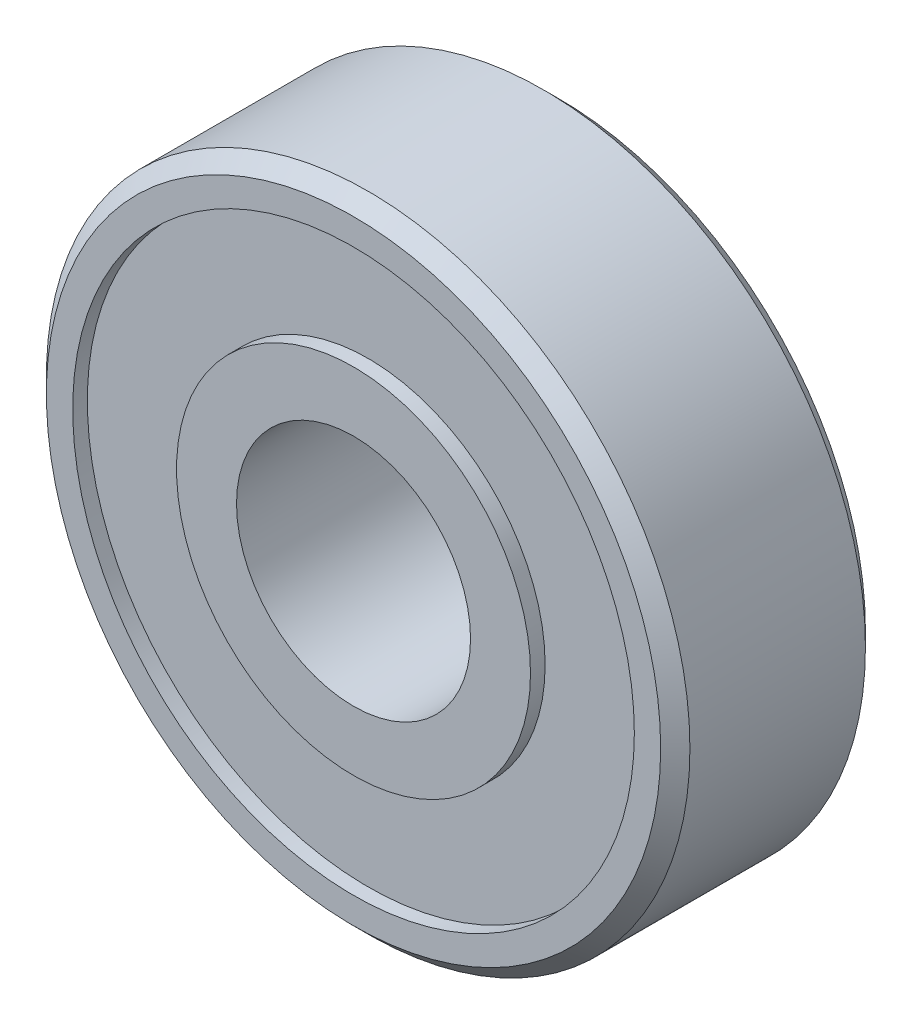
ISO-10303-21;
HEADER;
FILE_DESCRIPTION(('STEP AP214'),'2;1');
FILE_NAME('part.step','',(''),(''),'','','');
FILE_SCHEMA(('AUTOMOTIVE_DESIGN { 1 0 10303 214 1 1 1 1 }'));
ENDSEC;
DATA;
#1=APPLICATION_CONTEXT('core data for automotive mechanical design processes');
#2=APPLICATION_PROTOCOL_DEFINITION('international standard','automotive_design',2000,#1);
#3=PRODUCT_CONTEXT('',#1,'mechanical');
#4=PRODUCT('Part','Part','',(#3));
#5=PRODUCT_RELATED_PRODUCT_CATEGORY('part','',(#4));
#6=PRODUCT_DEFINITION_FORMATION('','',#4);
#7=PRODUCT_DEFINITION_CONTEXT('part definition',#1,'design');
#8=PRODUCT_DEFINITION('design','',#6,#7);
#9=PRODUCT_DEFINITION_SHAPE('','',#8);
#10=(LENGTH_UNIT() NAMED_UNIT(*) SI_UNIT(.MILLI.,.METRE.));
#11=(NAMED_UNIT(*) PLANE_ANGLE_UNIT() SI_UNIT($,.RADIAN.));
#12=(NAMED_UNIT(*) SI_UNIT($,.STERADIAN.) SOLID_ANGLE_UNIT());
#13=UNCERTAINTY_MEASURE_WITH_UNIT(LENGTH_MEASURE(1.E-05),#10,'distance_accuracy_value','');
#14=(GEOMETRIC_REPRESENTATION_CONTEXT(3) GLOBAL_UNCERTAINTY_ASSIGNED_CONTEXT((#13)) GLOBAL_UNIT_ASSIGNED_CONTEXT((#10,
#11,#12)) REPRESENTATION_CONTEXT('',''));
#15=CARTESIAN_POINT('',(0.,0.,0.));
#16=DIRECTION('',(0.,0.,1.));
#17=DIRECTION('',(1.,0.,0.));
#18=AXIS2_PLACEMENT_3D('',#15,#16,#17);
#19=CARTESIAN_POINT('',(0.,0.,-3.5));
#20=DIRECTION('',(0.,0.,1.));
#21=DIRECTION('',(1.,0.,0.));
#22=AXIS2_PLACEMENT_3D('',#19,#20,#21);
#23=PLANE('',#22);
#24=CARTESIAN_POINT('',(0.,0.,-3.5));
#25=DIRECTION('',(0.,0.,1.));
#26=DIRECTION('',(1.,0.,0.));
#27=AXIS2_PLACEMENT_3D('',#24,#25,#26);
#28=CIRCLE('',#27,4.);
#29=CARTESIAN_POINT('',(4.,0.,-3.5));
#30=VERTEX_POINT('',#29);
#31=EDGE_CURVE('E53',#30,#30,#28,.T.);
#32=ORIENTED_EDGE('',*,*,#31,.T.);
#33=EDGE_LOOP('',(#32));
#34=FACE_BOUND('',#33,.T.);
#35=CARTESIAN_POINT('',(0.,0.,-3.5));
#36=DIRECTION('',(0.,0.,1.));
#37=DIRECTION('',(1.,0.,0.));
#38=AXIS2_PLACEMENT_3D('',#35,#36,#37);
#39=CIRCLE('',#38,6.05);
#40=CARTESIAN_POINT('',(6.05,0.,-3.5));
#41=VERTEX_POINT('',#40);
#42=EDGE_CURVE('E75',#41,#41,#39,.T.);
#43=ORIENTED_EDGE('',*,*,#42,.F.);
#44=EDGE_LOOP('',(#43));
#45=FACE_BOUND('',#44,.T.);
#46=ADVANCED_FACE('F32',(#34,#45),#23,.F.);
#47=CARTESIAN_POINT('',(0.,0.,3.5));
#48=DIRECTION('',(0.,0.,1.));
#49=DIRECTION('',(1.,0.,0.));
#50=AXIS2_PLACEMENT_3D('',#47,#48,#49);
#51=PLANE('',#50);
#52=CARTESIAN_POINT('',(0.,0.,3.5));
#53=DIRECTION('',(0.,0.,1.));
#54=DIRECTION('',(1.,0.,0.));
#55=AXIS2_PLACEMENT_3D('',#52,#53,#54);
#56=CIRCLE('',#55,4.);
#57=CARTESIAN_POINT('',(4.,0.,3.5));
#58=VERTEX_POINT('',#57);
#59=EDGE_CURVE('E52',#58,#58,#56,.T.);
#60=ORIENTED_EDGE('',*,*,#59,.F.);
#61=EDGE_LOOP('',(#60));
#62=FACE_BOUND('',#61,.T.);
#63=CARTESIAN_POINT('',(0.,0.,3.5));
#64=DIRECTION('',(0.,0.,1.));
#65=DIRECTION('',(1.,0.,0.));
#66=AXIS2_PLACEMENT_3D('',#63,#64,#65);
#67=CIRCLE('',#66,6.05);
#68=CARTESIAN_POINT('',(6.05,0.,3.5));
#69=VERTEX_POINT('',#68);
#70=EDGE_CURVE('E63',#69,#69,#67,.T.);
#71=ORIENTED_EDGE('',*,*,#70,.T.);
#72=EDGE_LOOP('',(#71));
#73=FACE_BOUND('',#72,.T.);
#74=ADVANCED_FACE('F95',(#62,#73),#51,.T.);
#75=CARTESIAN_POINT('',(0.,0.,3.5));
#76=DIRECTION('',(0.,0.,1.));
#77=DIRECTION('',(1.,0.,0.));
#78=AXIS2_PLACEMENT_3D('',#75,#76,#77);
#79=CIRCLE('',#78,9.6);
#80=CARTESIAN_POINT('',(9.6,0.,3.5));
#81=VERTEX_POINT('',#80);
#82=EDGE_CURVE('E59',#81,#81,#79,.T.);
#83=ORIENTED_EDGE('',*,*,#82,.F.);
#84=EDGE_LOOP('',(#83));
#85=FACE_BOUND('',#84,.T.);
#86=CARTESIAN_POINT('',(0.,0.,3.5));
#87=DIRECTION('',(0.,0.,1.));
#88=DIRECTION('',(1.,0.,0.));
#89=AXIS2_PLACEMENT_3D('',#86,#87,#88);
#90=CIRCLE('',#89,10.5);
#91=CARTESIAN_POINT('',(10.5,0.,3.5));
#92=VERTEX_POINT('',#91);
#93=EDGE_CURVE('E10',#92,#92,#90,.T.);
#94=ORIENTED_EDGE('',*,*,#93,.T.);
#95=EDGE_LOOP('',(#94));
#96=FACE_BOUND('',#95,.T.);
#97=ADVANCED_FACE('F102',(#85,#96),#51,.T.);
#98=CARTESIAN_POINT('',(0.,0.,-3.5));
#99=DIRECTION('',(0.,0.,1.));
#100=DIRECTION('',(1.,0.,0.));
#101=AXIS2_PLACEMENT_3D('',#98,#99,#100);
#102=CIRCLE('',#101,9.6);
#103=CARTESIAN_POINT('',(9.6,0.,-3.5));
#104=VERTEX_POINT('',#103);
#105=EDGE_CURVE('E71',#104,#104,#102,.T.);
#106=ORIENTED_EDGE('',*,*,#105,.T.);
#107=EDGE_LOOP('',(#106));
#108=FACE_BOUND('',#107,.T.);
#109=CARTESIAN_POINT('',(0.,0.,-3.5));
#110=DIRECTION('',(0.,0.,1.));
#111=DIRECTION('',(1.,0.,0.));
#112=AXIS2_PLACEMENT_3D('',#109,#110,#111);
#113=CIRCLE('',#112,10.5);
#114=CARTESIAN_POINT('',(10.5,0.,-3.5));
#115=VERTEX_POINT('',#114);
#116=EDGE_CURVE('E39',#115,#115,#113,.F.);
#117=ORIENTED_EDGE('',*,*,#116,.T.);
#118=EDGE_LOOP('',(#117));
#119=FACE_BOUND('',#118,.T.);
#120=ADVANCED_FACE('F98',(#108,#119),#23,.F.);
#121=CARTESIAN_POINT('',(0.,0.,3.5));
#122=DIRECTION('',(0.,0.,-1.));
#123=DIRECTION('',(-1.,0.,0.));
#124=AXIS2_PLACEMENT_3D('',#121,#122,#123);
#125=CYLINDRICAL_SURFACE('',#124,11.);
#126=CARTESIAN_POINT('',(0.,0.,-3.));
#127=DIRECTION('',(0.,0.,1.));
#128=DIRECTION('',(1.,0.,0.));
#129=AXIS2_PLACEMENT_3D('',#126,#127,#128);
#130=CIRCLE('',#129,11.);
#131=CARTESIAN_POINT('',(11.,0.,-3.));
#132=VERTEX_POINT('',#131);
#133=EDGE_CURVE('E43',#132,#132,#130,.T.);
#134=ORIENTED_EDGE('',*,*,#133,.T.);
#135=EDGE_LOOP('',(#134));
#136=FACE_BOUND('',#135,.T.);
#137=CARTESIAN_POINT('',(0.,0.,3.00000000000001));
#138=DIRECTION('',(0.,0.,1.));
#139=DIRECTION('',(1.,0.,0.));
#140=AXIS2_PLACEMENT_3D('',#137,#138,#139);
#141=CIRCLE('',#140,11.);
#142=CARTESIAN_POINT('',(11.,0.,3.00000000000001));
#143=VERTEX_POINT('',#142);
#144=EDGE_CURVE('E47',#143,#143,#141,.F.);
#145=ORIENTED_EDGE('',*,*,#144,.T.);
#146=EDGE_LOOP('',(#145));
#147=FACE_BOUND('',#146,.T.);
#148=ADVANCED_FACE('F107',(#136,#147),#125,.T.);
#149=CARTESIAN_POINT('',(0.,0.,3.5));
#150=DIRECTION('',(0.,0.,-1.));
#151=DIRECTION('',(-1.,0.,0.));
#152=AXIS2_PLACEMENT_3D('',#149,#150,#151);
#153=CYLINDRICAL_SURFACE('',#152,4.);
#154=ORIENTED_EDGE('',*,*,#59,.T.);
#155=EDGE_LOOP('',(#154));
#156=FACE_BOUND('',#155,.T.);
#157=ORIENTED_EDGE('',*,*,#31,.F.);
#158=EDGE_LOOP('',(#157));
#159=FACE_BOUND('',#158,.T.);
#160=ADVANCED_FACE('F113',(#156,#159),#153,.F.);
#161=CARTESIAN_POINT('',(0.,0.,-3.));
#162=DIRECTION('',(0.,0.,1.));
#163=DIRECTION('',(1.,0.,0.));
#164=AXIS2_PLACEMENT_3D('',#161,#162,#163);
#165=CONICAL_SURFACE('',#164,11.,0.785398163397452);
#166=ORIENTED_EDGE('',*,*,#116,.F.);
#167=EDGE_LOOP('',(#166));
#168=FACE_BOUND('',#167,.T.);
#169=ORIENTED_EDGE('',*,*,#133,.F.);
#170=EDGE_LOOP('',(#169));
#171=FACE_BOUND('',#170,.T.);
#172=ADVANCED_FACE('F138',(#168,#171),#165,.T.);
#173=CARTESIAN_POINT('',(0.,0.,3.5));
#174=DIRECTION('',(0.,0.,-1.));
#175=DIRECTION('',(-1.,0.,0.));
#176=AXIS2_PLACEMENT_3D('',#173,#174,#175);
#177=CONICAL_SURFACE('',#176,10.5,0.785398163397448);
#178=ORIENTED_EDGE('',*,*,#144,.F.);
#179=EDGE_LOOP('',(#178));
#180=FACE_BOUND('',#179,.T.);
#181=ORIENTED_EDGE('',*,*,#93,.F.);
#182=EDGE_LOOP('',(#181));
#183=FACE_BOUND('',#182,.T.);
#184=ADVANCED_FACE('F34',(#180,#183),#177,.T.);
#185=CARTESIAN_POINT('',(0.,0.,3.));
#186=DIRECTION('',(0.,0.,1.));
#187=DIRECTION('',(1.,0.,0.));
#188=AXIS2_PLACEMENT_3D('',#185,#186,#187);
#189=CYLINDRICAL_SURFACE('',#188,6.05);
#190=CARTESIAN_POINT('',(0.,0.,3.));
#191=DIRECTION('',(0.,0.,1.));
#192=DIRECTION('',(1.,0.,0.));
#193=AXIS2_PLACEMENT_3D('',#190,#191,#192);
#194=CIRCLE('',#193,6.05);
#195=CARTESIAN_POINT('',(6.05,0.,3.));
#196=VERTEX_POINT('',#195);
#197=EDGE_CURVE('E62',#196,#196,#194,.T.);
#198=ORIENTED_EDGE('',*,*,#197,.T.);
#199=EDGE_LOOP('',(#198));
#200=FACE_BOUND('',#199,.T.);
#201=ORIENTED_EDGE('',*,*,#70,.F.);
#202=EDGE_LOOP('',(#201));
#203=FACE_BOUND('',#202,.T.);
#204=ADVANCED_FACE('F132',(#200,#203),#189,.T.);
#205=CARTESIAN_POINT('',(0.,0.,3.));
#206=DIRECTION('',(0.,0.,1.));
#207=DIRECTION('',(1.,0.,0.));
#208=AXIS2_PLACEMENT_3D('',#205,#206,#207);
#209=CYLINDRICAL_SURFACE('',#208,9.6);
#210=CARTESIAN_POINT('',(0.,0.,3.));
#211=DIRECTION('',(0.,0.,1.));
#212=DIRECTION('',(1.,0.,0.));
#213=AXIS2_PLACEMENT_3D('',#210,#211,#212);
#214=CIRCLE('',#213,9.6);
#215=CARTESIAN_POINT('',(9.6,0.,3.));
#216=VERTEX_POINT('',#215);
#217=EDGE_CURVE('E56',#216,#216,#214,.T.);
#218=ORIENTED_EDGE('',*,*,#217,.F.);
#219=EDGE_LOOP('',(#218));
#220=FACE_BOUND('',#219,.T.);
#221=ORIENTED_EDGE('',*,*,#82,.T.);
#222=EDGE_LOOP('',(#221));
#223=FACE_BOUND('',#222,.T.);
#224=ADVANCED_FACE('F128',(#220,#223),#209,.F.);
#225=CARTESIAN_POINT('',(0.,0.,3.));
#226=DIRECTION('',(0.,0.,1.));
#227=DIRECTION('',(1.,0.,0.));
#228=AXIS2_PLACEMENT_3D('',#225,#226,#227);
#229=PLANE('',#228);
#230=ORIENTED_EDGE('',*,*,#197,.F.);
#231=EDGE_LOOP('',(#230));
#232=FACE_BOUND('',#231,.T.);
#233=ORIENTED_EDGE('',*,*,#217,.T.);
#234=EDGE_LOOP('',(#233));
#235=FACE_BOUND('',#234,.T.);
#236=ADVANCED_FACE('F90',(#232,#235),#229,.T.);
#237=CARTESIAN_POINT('',(0.,0.,-3.));
#238=DIRECTION('',(0.,0.,-1.));
#239=DIRECTION('',(-1.,0.,0.));
#240=AXIS2_PLACEMENT_3D('',#237,#238,#239);
#241=CYLINDRICAL_SURFACE('',#240,6.05);
#242=CARTESIAN_POINT('',(0.,0.,-3.));
#243=DIRECTION('',(0.,0.,1.));
#244=DIRECTION('',(1.,0.,0.));
#245=AXIS2_PLACEMENT_3D('',#242,#243,#244);
#246=CIRCLE('',#245,6.05);
#247=CARTESIAN_POINT('',(6.05,0.,-3.));
#248=VERTEX_POINT('',#247);
#249=EDGE_CURVE('E74',#248,#248,#246,.T.);
#250=ORIENTED_EDGE('',*,*,#249,.F.);
#251=EDGE_LOOP('',(#250));
#252=FACE_BOUND('',#251,.T.);
#253=ORIENTED_EDGE('',*,*,#42,.T.);
#254=EDGE_LOOP('',(#253));
#255=FACE_BOUND('',#254,.T.);
#256=ADVANCED_FACE('F86',(#252,#255),#241,.T.);
#257=CARTESIAN_POINT('',(0.,0.,-3.));
#258=DIRECTION('',(0.,0.,-1.));
#259=DIRECTION('',(-1.,0.,0.));
#260=AXIS2_PLACEMENT_3D('',#257,#258,#259);
#261=CYLINDRICAL_SURFACE('',#260,9.6);
#262=CARTESIAN_POINT('',(0.,0.,-3.));
#263=DIRECTION('',(0.,0.,1.));
#264=DIRECTION('',(1.,0.,0.));
#265=AXIS2_PLACEMENT_3D('',#262,#263,#264);
#266=CIRCLE('',#265,9.6);
#267=CARTESIAN_POINT('',(9.6,0.,-3.));
#268=VERTEX_POINT('',#267);
#269=EDGE_CURVE('E66',#268,#268,#266,.T.);
#270=ORIENTED_EDGE('',*,*,#269,.T.);
#271=EDGE_LOOP('',(#270));
#272=FACE_BOUND('',#271,.T.);
#273=ORIENTED_EDGE('',*,*,#105,.F.);
#274=EDGE_LOOP('',(#273));
#275=FACE_BOUND('',#274,.T.);
#276=ADVANCED_FACE('F89',(#272,#275),#261,.F.);
#277=CARTESIAN_POINT('',(0.,0.,-3.));
#278=DIRECTION('',(0.,0.,-1.));
#279=DIRECTION('',(1.,0.,0.));
#280=AXIS2_PLACEMENT_3D('',#277,#278,#279);
#281=PLANE('',#280);
#282=ORIENTED_EDGE('',*,*,#249,.T.);
#283=EDGE_LOOP('',(#282));
#284=FACE_BOUND('',#283,.T.);
#285=ORIENTED_EDGE('',*,*,#269,.F.);
#286=EDGE_LOOP('',(#285));
#287=FACE_BOUND('',#286,.T.);
#288=ADVANCED_FACE('F83',(#284,#287),#281,.T.);
#289=CLOSED_SHELL('',(#46,#74,#97,#120,#148,#160,#172,#184,#204,#224,#236,#256,#276,#288));
#290=MANIFOLD_SOLID_BREP('B2',#289);
#291=ADVANCED_BREP_SHAPE_REPRESENTATION('',(#18,#290),#14);
#292=SHAPE_DEFINITION_REPRESENTATION(#9,#291);
ENDSEC;
END-ISO-10303-21;
